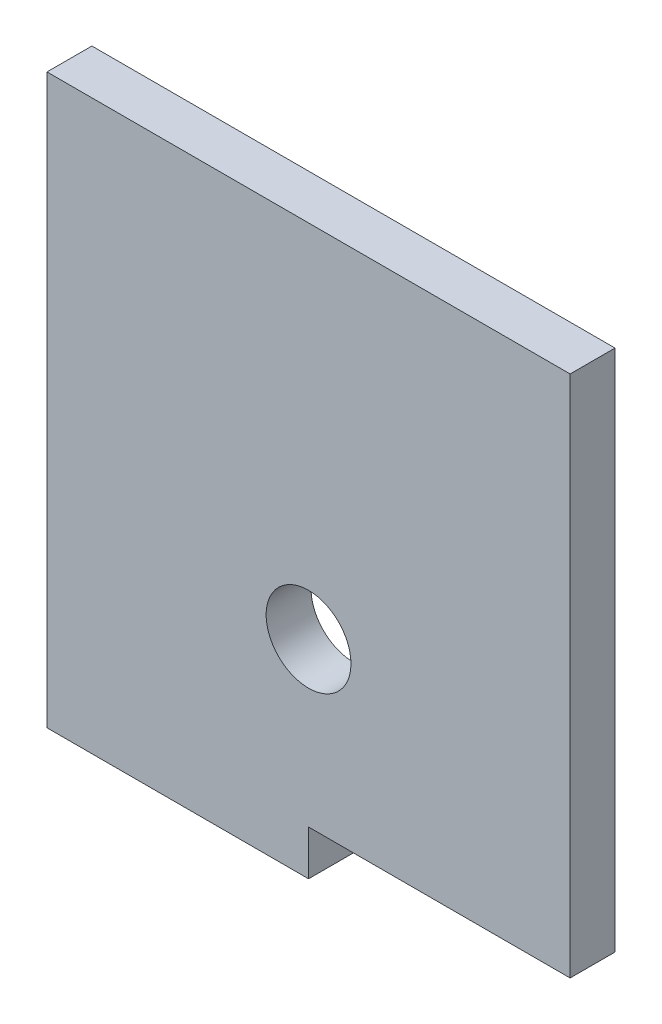
ISO-10303-21;
HEADER;
FILE_DESCRIPTION(('STEP AP214'),'2;1');
FILE_NAME('part.step','',(''),(''),'','','');
FILE_SCHEMA(('AUTOMOTIVE_DESIGN { 1 0 10303 214 1 1 1 1 }'));
ENDSEC;
DATA;
#1=APPLICATION_CONTEXT('core data for automotive mechanical design processes');
#2=APPLICATION_PROTOCOL_DEFINITION('international standard','automotive_design',2000,#1);
#3=PRODUCT_CONTEXT('',#1,'mechanical');
#4=PRODUCT('Part','Part','',(#3));
#5=PRODUCT_RELATED_PRODUCT_CATEGORY('part','',(#4));
#6=PRODUCT_DEFINITION_FORMATION('','',#4);
#7=PRODUCT_DEFINITION_CONTEXT('part definition',#1,'design');
#8=PRODUCT_DEFINITION('design','',#6,#7);
#9=PRODUCT_DEFINITION_SHAPE('','',#8);
#10=(LENGTH_UNIT() NAMED_UNIT(*) SI_UNIT(.MILLI.,.METRE.));
#11=(NAMED_UNIT(*) PLANE_ANGLE_UNIT() SI_UNIT($,.RADIAN.));
#12=(NAMED_UNIT(*) SI_UNIT($,.STERADIAN.) SOLID_ANGLE_UNIT());
#13=UNCERTAINTY_MEASURE_WITH_UNIT(LENGTH_MEASURE(1.E-05),#10,'distance_accuracy_value','');
#14=(GEOMETRIC_REPRESENTATION_CONTEXT(3) GLOBAL_UNCERTAINTY_ASSIGNED_CONTEXT((#13)) GLOBAL_UNIT_ASSIGNED_CONTEXT((#10,
#11,#12)) REPRESENTATION_CONTEXT('',''));
#15=CARTESIAN_POINT('',(0.,0.,0.));
#16=DIRECTION('',(0.,0.,1.));
#17=DIRECTION('',(1.,0.,0.));
#18=AXIS2_PLACEMENT_3D('',#15,#16,#17);
#19=CARTESIAN_POINT('',(0.,0.,3.175));
#20=DIRECTION('',(0.,0.,-1.));
#21=DIRECTION('',(-1.,0.,0.));
#22=AXIS2_PLACEMENT_3D('',#19,#20,#21);
#23=PLANE('',#22);
#24=DIRECTION('',(0.,-1.,0.));
#25=VECTOR('',#24,1.);
#26=CARTESIAN_POINT('',(0.,-3.175,3.175));
#27=LINE('',#26,#25);
#28=CARTESIAN_POINT('',(0.,37.,3.175));
#29=VERTEX_POINT('',#28);
#30=CARTESIAN_POINT('',(0.,-3.175,3.175));
#31=VERTEX_POINT('',#30);
#32=EDGE_CURVE('E50',#29,#31,#27,.T.);
#33=ORIENTED_EDGE('',*,*,#32,.T.);
#34=DIRECTION('',(1.,0.,0.));
#35=VECTOR('',#34,1.);
#36=CARTESIAN_POINT('',(18.5,-3.175,3.175));
#37=LINE('',#36,#35);
#38=CARTESIAN_POINT('',(18.5,-3.175,3.175));
#39=VERTEX_POINT('',#38);
#40=EDGE_CURVE('E88',#31,#39,#37,.T.);
#41=ORIENTED_EDGE('',*,*,#40,.T.);
#42=DIRECTION('',(0.,1.,0.));
#43=VECTOR('',#42,1.);
#44=CARTESIAN_POINT('',(18.5,0.,3.175));
#45=LINE('',#44,#43);
#46=CARTESIAN_POINT('',(18.5,0.,3.175));
#47=VERTEX_POINT('',#46);
#48=EDGE_CURVE('E102',#39,#47,#45,.T.);
#49=ORIENTED_EDGE('',*,*,#48,.T.);
#50=DIRECTION('',(1.,0.,0.));
#51=VECTOR('',#50,1.);
#52=CARTESIAN_POINT('',(18.5,0.,3.175));
#53=LINE('',#52,#51);
#54=CARTESIAN_POINT('',(37.,0.,3.175));
#55=VERTEX_POINT('',#54);
#56=EDGE_CURVE('E96',#47,#55,#53,.T.);
#57=ORIENTED_EDGE('',*,*,#56,.T.);
#58=DIRECTION('',(0.,1.,0.));
#59=VECTOR('',#58,1.);
#60=CARTESIAN_POINT('',(37.,0.,3.175));
#61=LINE('',#60,#59);
#62=CARTESIAN_POINT('',(37.,37.,3.175));
#63=VERTEX_POINT('',#62);
#64=EDGE_CURVE('E100',#55,#63,#61,.T.);
#65=ORIENTED_EDGE('',*,*,#64,.T.);
#66=DIRECTION('',(-1.,0.,0.));
#67=VECTOR('',#66,1.);
#68=CARTESIAN_POINT('',(0.,37.,3.175));
#69=LINE('',#68,#67);
#70=EDGE_CURVE('E116',#63,#29,#69,.T.);
#71=ORIENTED_EDGE('',*,*,#70,.T.);
#72=EDGE_LOOP('',(#33,#41,#49,#57,#65,#71));
#73=FACE_BOUND('',#72,.T.);
#74=CARTESIAN_POINT('',(18.4999999999999,11.5000000000001,3.175));
#75=DIRECTION('',(0.,0.,1.));
#76=DIRECTION('',(1.,0.,0.));
#77=AXIS2_PLACEMENT_3D('',#74,#75,#76);
#78=CIRCLE('',#77,3.);
#79=CARTESIAN_POINT('',(21.4999999999999,11.5000000000001,3.175));
#80=VERTEX_POINT('',#79);
#81=EDGE_CURVE('E125',#80,#80,#78,.T.);
#82=ORIENTED_EDGE('',*,*,#81,.F.);
#83=EDGE_LOOP('',(#82));
#84=FACE_BOUND('',#83,.T.);
#85=ADVANCED_FACE('F33',(#73,#84),#23,.F.);
#86=CARTESIAN_POINT('',(0.,0.,0.));
#87=DIRECTION('',(0.,0.,-1.));
#88=DIRECTION('',(-1.,0.,0.));
#89=AXIS2_PLACEMENT_3D('',#86,#87,#88);
#90=PLANE('',#89);
#91=DIRECTION('',(1.,0.,0.));
#92=VECTOR('',#91,1.);
#93=CARTESIAN_POINT('',(18.5,-3.175,0.));
#94=LINE('',#93,#92);
#95=CARTESIAN_POINT('',(0.,-3.175,0.));
#96=VERTEX_POINT('',#95);
#97=CARTESIAN_POINT('',(18.5,-3.175,0.));
#98=VERTEX_POINT('',#97);
#99=EDGE_CURVE('E122',#96,#98,#94,.T.);
#100=ORIENTED_EDGE('',*,*,#99,.F.);
#101=DIRECTION('',(0.,-1.,0.));
#102=VECTOR('',#101,1.);
#103=CARTESIAN_POINT('',(0.,0.,0.));
#104=LINE('',#103,#102);
#105=CARTESIAN_POINT('',(0.,37.,0.));
#106=VERTEX_POINT('',#105);
#107=EDGE_CURVE('E130',#106,#96,#104,.T.);
#108=ORIENTED_EDGE('',*,*,#107,.F.);
#109=DIRECTION('',(-1.,0.,0.));
#110=VECTOR('',#109,1.);
#111=CARTESIAN_POINT('',(0.,37.,0.));
#112=LINE('',#111,#110);
#113=CARTESIAN_POINT('',(37.,37.,0.));
#114=VERTEX_POINT('',#113);
#115=EDGE_CURVE('E81',#114,#106,#112,.T.);
#116=ORIENTED_EDGE('',*,*,#115,.F.);
#117=DIRECTION('',(0.,1.,0.));
#118=VECTOR('',#117,1.);
#119=CARTESIAN_POINT('',(37.,0.,0.));
#120=LINE('',#119,#118);
#121=CARTESIAN_POINT('',(37.,0.,0.));
#122=VERTEX_POINT('',#121);
#123=EDGE_CURVE('E74',#122,#114,#120,.T.);
#124=ORIENTED_EDGE('',*,*,#123,.F.);
#125=DIRECTION('',(1.,0.,0.));
#126=VECTOR('',#125,1.);
#127=CARTESIAN_POINT('',(18.5,0.,0.));
#128=LINE('',#127,#126);
#129=CARTESIAN_POINT('',(18.5,0.,0.));
#130=VERTEX_POINT('',#129);
#131=EDGE_CURVE('E110',#130,#122,#128,.T.);
#132=ORIENTED_EDGE('',*,*,#131,.F.);
#133=DIRECTION('',(0.,1.,0.));
#134=VECTOR('',#133,1.);
#135=CARTESIAN_POINT('',(18.5,0.,0.));
#136=LINE('',#135,#134);
#137=EDGE_CURVE('E124',#98,#130,#136,.T.);
#138=ORIENTED_EDGE('',*,*,#137,.F.);
#139=EDGE_LOOP('',(#100,#108,#116,#124,#132,#138));
#140=FACE_BOUND('',#139,.T.);
#141=CARTESIAN_POINT('',(18.4999999999999,11.5000000000001,0.));
#142=DIRECTION('',(0.,0.,1.));
#143=DIRECTION('',(1.,0.,0.));
#144=AXIS2_PLACEMENT_3D('',#141,#142,#143);
#145=CIRCLE('',#144,3.);
#146=CARTESIAN_POINT('',(21.4999999999999,11.5000000000001,0.));
#147=VERTEX_POINT('',#146);
#148=EDGE_CURVE('E148',#147,#147,#145,.T.);
#149=ORIENTED_EDGE('',*,*,#148,.T.);
#150=EDGE_LOOP('',(#149));
#151=FACE_BOUND('',#150,.T.);
#152=ADVANCED_FACE('F140',(#140,#151),#90,.T.);
#153=CARTESIAN_POINT('',(18.5,-3.175,3.175));
#154=DIRECTION('',(0.,1.,0.));
#155=DIRECTION('',(-1.,0.,0.));
#156=AXIS2_PLACEMENT_3D('',#153,#154,#155);
#157=PLANE('',#156);
#158=ORIENTED_EDGE('',*,*,#99,.T.);
#159=DIRECTION('',(0.,0.,-1.));
#160=VECTOR('',#159,1.);
#161=CARTESIAN_POINT('',(18.5,-3.175,3.175));
#162=LINE('',#161,#160);
#163=EDGE_CURVE('E42',#39,#98,#162,.T.);
#164=ORIENTED_EDGE('',*,*,#163,.F.);
#165=ORIENTED_EDGE('',*,*,#40,.F.);
#166=DIRECTION('',(0.,0.,-1.));
#167=VECTOR('',#166,1.);
#168=CARTESIAN_POINT('',(0.,-3.175,3.175));
#169=LINE('',#168,#167);
#170=EDGE_CURVE('E11',#31,#96,#169,.T.);
#171=ORIENTED_EDGE('',*,*,#170,.T.);
#172=EDGE_LOOP('',(#158,#164,#165,#171));
#173=FACE_BOUND('',#172,.T.);
#174=ADVANCED_FACE('F35',(#173),#157,.F.);
#175=CARTESIAN_POINT('',(18.5,0.,3.175));
#176=DIRECTION('',(-1.,0.,0.));
#177=DIRECTION('',(0.,0.,1.));
#178=AXIS2_PLACEMENT_3D('',#175,#176,#177);
#179=PLANE('',#178);
#180=ORIENTED_EDGE('',*,*,#137,.T.);
#181=DIRECTION('',(0.,0.,-1.));
#182=VECTOR('',#181,1.);
#183=CARTESIAN_POINT('',(18.5,0.,3.175));
#184=LINE('',#183,#182);
#185=EDGE_CURVE('E111',#47,#130,#184,.T.);
#186=ORIENTED_EDGE('',*,*,#185,.F.);
#187=ORIENTED_EDGE('',*,*,#48,.F.);
#188=ORIENTED_EDGE('',*,*,#163,.T.);
#189=EDGE_LOOP('',(#180,#186,#187,#188));
#190=FACE_BOUND('',#189,.T.);
#191=ADVANCED_FACE('F137',(#190),#179,.F.);
#192=CARTESIAN_POINT('',(18.5,0.,3.175));
#193=DIRECTION('',(0.,1.,0.));
#194=DIRECTION('',(-1.,0.,0.));
#195=AXIS2_PLACEMENT_3D('',#192,#193,#194);
#196=PLANE('',#195);
#197=ORIENTED_EDGE('',*,*,#131,.T.);
#198=DIRECTION('',(0.,0.,-1.));
#199=VECTOR('',#198,1.);
#200=CARTESIAN_POINT('',(37.,0.,3.175));
#201=LINE('',#200,#199);
#202=EDGE_CURVE('E107',#55,#122,#201,.T.);
#203=ORIENTED_EDGE('',*,*,#202,.F.);
#204=ORIENTED_EDGE('',*,*,#56,.F.);
#205=ORIENTED_EDGE('',*,*,#185,.T.);
#206=EDGE_LOOP('',(#197,#203,#204,#205));
#207=FACE_BOUND('',#206,.T.);
#208=ADVANCED_FACE('F108',(#207),#196,.F.);
#209=CARTESIAN_POINT('',(37.,0.,3.175));
#210=DIRECTION('',(-1.,0.,0.));
#211=DIRECTION('',(0.,0.,1.));
#212=AXIS2_PLACEMENT_3D('',#209,#210,#211);
#213=PLANE('',#212);
#214=ORIENTED_EDGE('',*,*,#123,.T.);
#215=DIRECTION('',(0.,0.,-1.));
#216=VECTOR('',#215,1.);
#217=CARTESIAN_POINT('',(37.,37.,3.175));
#218=LINE('',#217,#216);
#219=EDGE_CURVE('E112',#63,#114,#218,.T.);
#220=ORIENTED_EDGE('',*,*,#219,.F.);
#221=ORIENTED_EDGE('',*,*,#64,.F.);
#222=ORIENTED_EDGE('',*,*,#202,.T.);
#223=EDGE_LOOP('',(#214,#220,#221,#222));
#224=FACE_BOUND('',#223,.T.);
#225=ADVANCED_FACE('F114',(#224),#213,.F.);
#226=CARTESIAN_POINT('',(0.,37.,3.175));
#227=DIRECTION('',(0.,-1.,0.));
#228=DIRECTION('',(0.,0.,-1.));
#229=AXIS2_PLACEMENT_3D('',#226,#227,#228);
#230=PLANE('',#229);
#231=ORIENTED_EDGE('',*,*,#115,.T.);
#232=DIRECTION('',(0.,0.,-1.));
#233=VECTOR('',#232,1.);
#234=CARTESIAN_POINT('',(0.,37.,3.175));
#235=LINE('',#234,#233);
#236=EDGE_CURVE('E118',#29,#106,#235,.T.);
#237=ORIENTED_EDGE('',*,*,#236,.F.);
#238=ORIENTED_EDGE('',*,*,#70,.F.);
#239=ORIENTED_EDGE('',*,*,#219,.T.);
#240=EDGE_LOOP('',(#231,#237,#238,#239));
#241=FACE_BOUND('',#240,.T.);
#242=ADVANCED_FACE('F144',(#241),#230,.F.);
#243=CARTESIAN_POINT('',(0.,0.,3.175));
#244=DIRECTION('',(1.,0.,0.));
#245=DIRECTION('',(0.,0.,-1.));
#246=AXIS2_PLACEMENT_3D('',#243,#244,#245);
#247=PLANE('',#246);
#248=ORIENTED_EDGE('',*,*,#107,.T.);
#249=ORIENTED_EDGE('',*,*,#170,.F.);
#250=ORIENTED_EDGE('',*,*,#32,.F.);
#251=ORIENTED_EDGE('',*,*,#236,.T.);
#252=EDGE_LOOP('',(#248,#249,#250,#251));
#253=FACE_BOUND('',#252,.T.);
#254=ADVANCED_FACE('F143',(#253),#247,.F.);
#255=CARTESIAN_POINT('',(18.4999999999999,11.5000000000001,3.175));
#256=DIRECTION('',(0.,0.,-1.));
#257=DIRECTION('',(-1.,0.,0.));
#258=AXIS2_PLACEMENT_3D('',#255,#256,#257);
#259=CYLINDRICAL_SURFACE('',#258,3.);
#260=ORIENTED_EDGE('',*,*,#81,.T.);
#261=EDGE_LOOP('',(#260));
#262=FACE_BOUND('',#261,.T.);
#263=ORIENTED_EDGE('',*,*,#148,.F.);
#264=EDGE_LOOP('',(#263));
#265=FACE_BOUND('',#264,.T.);
#266=ADVANCED_FACE('F154',(#262,#265),#259,.F.);
#267=CLOSED_SHELL('',(#85,#152,#174,#191,#208,#225,#242,#254,#266));
#268=MANIFOLD_SOLID_BREP('B2',#267);
#269=ADVANCED_BREP_SHAPE_REPRESENTATION('',(#18,#268),#14);
#270=SHAPE_DEFINITION_REPRESENTATION(#9,#269);
ENDSEC;
END-ISO-10303-21;
